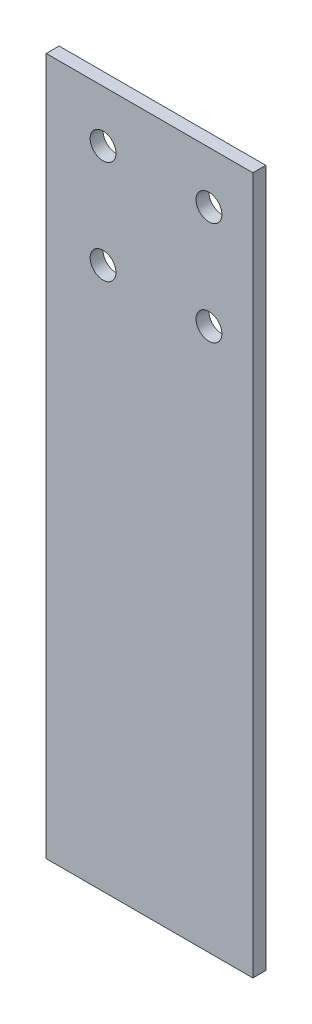
ISO-10303-21;
HEADER;
FILE_DESCRIPTION(('STEP AP214'),'2;1');
FILE_NAME('part.step','',(''),(''),'','','');
FILE_SCHEMA(('AUTOMOTIVE_DESIGN { 1 0 10303 214 1 1 1 1 }'));
ENDSEC;
DATA;
#1=APPLICATION_CONTEXT('core data for automotive mechanical design processes');
#2=APPLICATION_PROTOCOL_DEFINITION('international standard','automotive_design',2000,#1);
#3=PRODUCT_CONTEXT('',#1,'mechanical');
#4=PRODUCT('Part','Part','',(#3));
#5=PRODUCT_RELATED_PRODUCT_CATEGORY('part','',(#4));
#6=PRODUCT_DEFINITION_FORMATION('','',#4);
#7=PRODUCT_DEFINITION_CONTEXT('part definition',#1,'design');
#8=PRODUCT_DEFINITION('design','',#6,#7);
#9=PRODUCT_DEFINITION_SHAPE('','',#8);
#10=(LENGTH_UNIT() NAMED_UNIT(*) SI_UNIT(.MILLI.,.METRE.));
#11=(NAMED_UNIT(*) PLANE_ANGLE_UNIT() SI_UNIT($,.RADIAN.));
#12=(NAMED_UNIT(*) SI_UNIT($,.STERADIAN.) SOLID_ANGLE_UNIT());
#13=UNCERTAINTY_MEASURE_WITH_UNIT(LENGTH_MEASURE(1.E-05),#10,'distance_accuracy_value','');
#14=(GEOMETRIC_REPRESENTATION_CONTEXT(3) GLOBAL_UNCERTAINTY_ASSIGNED_CONTEXT((#13)) GLOBAL_UNIT_ASSIGNED_CONTEXT((#10,
#11,#12)) REPRESENTATION_CONTEXT('',''));
#15=CARTESIAN_POINT('',(0.,0.,0.));
#16=DIRECTION('',(0.,0.,1.));
#17=DIRECTION('',(1.,0.,0.));
#18=AXIS2_PLACEMENT_3D('',#15,#16,#17);
#19=CARTESIAN_POINT('',(-50.8,0.,-3.175));
#20=DIRECTION('',(0.,-1.,0.));
#21=DIRECTION('',(0.,0.,-1.));
#22=AXIS2_PLACEMENT_3D('',#19,#20,#21);
#23=PLANE('',#22);
#24=DIRECTION('',(1.,0.,0.));
#25=VECTOR('',#24,1.);
#26=CARTESIAN_POINT('',(-50.8,0.,0.));
#27=LINE('',#26,#25);
#28=CARTESIAN_POINT('',(-50.8,0.,0.));
#29=VERTEX_POINT('',#28);
#30=CARTESIAN_POINT('',(0.,0.,0.));
#31=VERTEX_POINT('',#30);
#32=EDGE_CURVE('E106',#29,#31,#27,.T.);
#33=ORIENTED_EDGE('',*,*,#32,.F.);
#34=DIRECTION('',(0.,0.,1.));
#35=VECTOR('',#34,1.);
#36=CARTESIAN_POINT('',(-50.8,0.,-3.175));
#37=LINE('',#36,#35);
#38=CARTESIAN_POINT('',(-50.8,0.,-3.175));
#39=VERTEX_POINT('',#38);
#40=EDGE_CURVE('E11',#39,#29,#37,.T.);
#41=ORIENTED_EDGE('',*,*,#40,.F.);
#42=DIRECTION('',(1.,0.,0.));
#43=VECTOR('',#42,1.);
#44=CARTESIAN_POINT('',(-50.8,0.,-3.175));
#45=LINE('',#44,#43);
#46=CARTESIAN_POINT('',(0.,0.,-3.175));
#47=VERTEX_POINT('',#46);
#48=EDGE_CURVE('E99',#39,#47,#45,.T.);
#49=ORIENTED_EDGE('',*,*,#48,.T.);
#50=DIRECTION('',(0.,0.,1.));
#51=VECTOR('',#50,1.);
#52=CARTESIAN_POINT('',(0.,0.,-3.175));
#53=LINE('',#52,#51);
#54=EDGE_CURVE('E44',#47,#31,#53,.T.);
#55=ORIENTED_EDGE('',*,*,#54,.T.);
#56=EDGE_LOOP('',(#33,#41,#49,#55));
#57=FACE_BOUND('',#56,.T.);
#58=ADVANCED_FACE('F41',(#57),#23,.T.);
#59=CARTESIAN_POINT('',(-50.8,171.45,-3.175));
#60=DIRECTION('',(-1.,0.,0.));
#61=DIRECTION('',(0.,-1.,0.));
#62=AXIS2_PLACEMENT_3D('',#59,#60,#61);
#63=PLANE('',#62);
#64=DIRECTION('',(0.,-1.,0.));
#65=VECTOR('',#64,1.);
#66=CARTESIAN_POINT('',(-50.8,171.45,0.));
#67=LINE('',#66,#65);
#68=CARTESIAN_POINT('',(-50.8,171.45,0.));
#69=VERTEX_POINT('',#68);
#70=EDGE_CURVE('E101',#69,#29,#67,.T.);
#71=ORIENTED_EDGE('',*,*,#70,.F.);
#72=DIRECTION('',(0.,0.,1.));
#73=VECTOR('',#72,1.);
#74=CARTESIAN_POINT('',(-50.8,171.45,-3.175));
#75=LINE('',#74,#73);
#76=CARTESIAN_POINT('',(-50.8,171.45,-3.175));
#77=VERTEX_POINT('',#76);
#78=EDGE_CURVE('E50',#77,#69,#75,.T.);
#79=ORIENTED_EDGE('',*,*,#78,.F.);
#80=DIRECTION('',(0.,-1.,0.));
#81=VECTOR('',#80,1.);
#82=CARTESIAN_POINT('',(-50.8,171.45,-3.175));
#83=LINE('',#82,#81);
#84=EDGE_CURVE('E96',#77,#39,#83,.T.);
#85=ORIENTED_EDGE('',*,*,#84,.T.);
#86=ORIENTED_EDGE('',*,*,#40,.T.);
#87=EDGE_LOOP('',(#71,#79,#85,#86));
#88=FACE_BOUND('',#87,.T.);
#89=ADVANCED_FACE('F117',(#88),#63,.T.);
#90=CARTESIAN_POINT('',(0.,171.45,-3.175));
#91=DIRECTION('',(0.,1.,0.));
#92=DIRECTION('',(0.,0.,1.));
#93=AXIS2_PLACEMENT_3D('',#90,#91,#92);
#94=PLANE('',#93);
#95=DIRECTION('',(-1.,0.,0.));
#96=VECTOR('',#95,1.);
#97=CARTESIAN_POINT('',(0.,171.45,0.));
#98=LINE('',#97,#96);
#99=CARTESIAN_POINT('',(0.,171.45,0.));
#100=VERTEX_POINT('',#99);
#101=EDGE_CURVE('E91',#100,#69,#98,.T.);
#102=ORIENTED_EDGE('',*,*,#101,.F.);
#103=DIRECTION('',(0.,0.,1.));
#104=VECTOR('',#103,1.);
#105=CARTESIAN_POINT('',(0.,171.45,-3.175));
#106=LINE('',#105,#104);
#107=CARTESIAN_POINT('',(0.,171.45,-3.175));
#108=VERTEX_POINT('',#107);
#109=EDGE_CURVE('E86',#108,#100,#106,.T.);
#110=ORIENTED_EDGE('',*,*,#109,.F.);
#111=DIRECTION('',(-1.,0.,0.));
#112=VECTOR('',#111,1.);
#113=CARTESIAN_POINT('',(0.,171.45,-3.175));
#114=LINE('',#113,#112);
#115=EDGE_CURVE('E89',#108,#77,#114,.T.);
#116=ORIENTED_EDGE('',*,*,#115,.T.);
#117=ORIENTED_EDGE('',*,*,#78,.T.);
#118=EDGE_LOOP('',(#102,#110,#116,#117));
#119=FACE_BOUND('',#118,.T.);
#120=ADVANCED_FACE('F88',(#119),#94,.T.);
#121=CARTESIAN_POINT('',(0.,0.,-3.175));
#122=DIRECTION('',(1.,0.,0.));
#123=DIRECTION('',(0.,0.,-1.));
#124=AXIS2_PLACEMENT_3D('',#121,#122,#123);
#125=PLANE('',#124);
#126=DIRECTION('',(0.,1.,0.));
#127=VECTOR('',#126,1.);
#128=CARTESIAN_POINT('',(0.,0.,0.));
#129=LINE('',#128,#127);
#130=EDGE_CURVE('E109',#31,#100,#129,.T.);
#131=ORIENTED_EDGE('',*,*,#130,.F.);
#132=ORIENTED_EDGE('',*,*,#54,.F.);
#133=DIRECTION('',(0.,1.,0.));
#134=VECTOR('',#133,1.);
#135=CARTESIAN_POINT('',(0.,0.,-3.175));
#136=LINE('',#135,#134);
#137=EDGE_CURVE('E95',#47,#108,#136,.T.);
#138=ORIENTED_EDGE('',*,*,#137,.T.);
#139=ORIENTED_EDGE('',*,*,#109,.T.);
#140=EDGE_LOOP('',(#131,#132,#138,#139));
#141=FACE_BOUND('',#140,.T.);
#142=ADVANCED_FACE('F98',(#141),#125,.T.);
#143=CARTESIAN_POINT('',(0.,0.,-3.175));
#144=DIRECTION('',(0.,0.,1.));
#145=DIRECTION('',(1.,0.,0.));
#146=AXIS2_PLACEMENT_3D('',#143,#144,#145);
#147=PLANE('',#146);
#148=CARTESIAN_POINT('',(-36.83,158.75,-3.175));
#149=DIRECTION('',(0.,0.,1.));
#150=DIRECTION('',(1.,0.,0.));
#151=AXIS2_PLACEMENT_3D('',#148,#149,#150);
#152=CIRCLE('',#151,3.175);
#153=CARTESIAN_POINT('',(-33.655,158.75,-3.175));
#154=VERTEX_POINT('',#153);
#155=EDGE_CURVE('E168',#154,#154,#152,.T.);
#156=ORIENTED_EDGE('',*,*,#155,.T.);
#157=EDGE_LOOP('',(#156));
#158=FACE_BOUND('',#157,.T.);
#159=CARTESIAN_POINT('',(-10.795,133.35,-3.175));
#160=DIRECTION('',(0.,0.,1.));
#161=DIRECTION('',(1.,0.,0.));
#162=AXIS2_PLACEMENT_3D('',#159,#160,#161);
#163=CIRCLE('',#162,3.175);
#164=CARTESIAN_POINT('',(-7.62000000000002,133.35,-3.175));
#165=VERTEX_POINT('',#164);
#166=EDGE_CURVE('E174',#165,#165,#163,.T.);
#167=ORIENTED_EDGE('',*,*,#166,.T.);
#168=EDGE_LOOP('',(#167));
#169=FACE_BOUND('',#168,.T.);
#170=CARTESIAN_POINT('',(-36.83,133.35,-3.175));
#171=DIRECTION('',(0.,0.,1.));
#172=DIRECTION('',(1.,0.,0.));
#173=AXIS2_PLACEMENT_3D('',#170,#171,#172);
#174=CIRCLE('',#173,3.175);
#175=CARTESIAN_POINT('',(-33.655,133.35,-3.175));
#176=VERTEX_POINT('',#175);
#177=EDGE_CURVE('E159',#176,#176,#174,.T.);
#178=ORIENTED_EDGE('',*,*,#177,.T.);
#179=EDGE_LOOP('',(#178));
#180=FACE_BOUND('',#179,.T.);
#181=CARTESIAN_POINT('',(-10.795,158.75,-3.175));
#182=DIRECTION('',(0.,0.,1.));
#183=DIRECTION('',(1.,0.,0.));
#184=AXIS2_PLACEMENT_3D('',#181,#182,#183);
#185=CIRCLE('',#184,3.175);
#186=CARTESIAN_POINT('',(-7.62000000000002,158.75,-3.175));
#187=VERTEX_POINT('',#186);
#188=EDGE_CURVE('E110',#187,#187,#185,.T.);
#189=ORIENTED_EDGE('',*,*,#188,.T.);
#190=EDGE_LOOP('',(#189));
#191=FACE_BOUND('',#190,.T.);
#192=ORIENTED_EDGE('',*,*,#48,.F.);
#193=ORIENTED_EDGE('',*,*,#84,.F.);
#194=ORIENTED_EDGE('',*,*,#115,.F.);
#195=ORIENTED_EDGE('',*,*,#137,.F.);
#196=EDGE_LOOP('',(#192,#193,#194,#195));
#197=FACE_BOUND('',#196,.T.);
#198=ADVANCED_FACE('F94',(#158,#169,#180,#191,#197),#147,.F.);
#199=CARTESIAN_POINT('',(0.,0.,0.));
#200=DIRECTION('',(0.,0.,1.));
#201=DIRECTION('',(1.,0.,0.));
#202=AXIS2_PLACEMENT_3D('',#199,#200,#201);
#203=PLANE('',#202);
#204=CARTESIAN_POINT('',(-36.83,158.75,0.));
#205=DIRECTION('',(0.,0.,1.));
#206=DIRECTION('',(1.,0.,0.));
#207=AXIS2_PLACEMENT_3D('',#204,#205,#206);
#208=CIRCLE('',#207,3.175);
#209=CARTESIAN_POINT('',(-33.655,158.75,0.));
#210=VERTEX_POINT('',#209);
#211=EDGE_CURVE('E171',#210,#210,#208,.T.);
#212=ORIENTED_EDGE('',*,*,#211,.F.);
#213=EDGE_LOOP('',(#212));
#214=FACE_BOUND('',#213,.T.);
#215=CARTESIAN_POINT('',(-10.795,133.35,0.));
#216=DIRECTION('',(0.,0.,1.));
#217=DIRECTION('',(1.,0.,0.));
#218=AXIS2_PLACEMENT_3D('',#215,#216,#217);
#219=CIRCLE('',#218,3.175);
#220=CARTESIAN_POINT('',(-7.62000000000002,133.35,0.));
#221=VERTEX_POINT('',#220);
#222=EDGE_CURVE('E165',#221,#221,#219,.T.);
#223=ORIENTED_EDGE('',*,*,#222,.F.);
#224=EDGE_LOOP('',(#223));
#225=FACE_BOUND('',#224,.T.);
#226=CARTESIAN_POINT('',(-36.83,133.35,0.));
#227=DIRECTION('',(0.,0.,1.));
#228=DIRECTION('',(1.,0.,0.));
#229=AXIS2_PLACEMENT_3D('',#226,#227,#228);
#230=CIRCLE('',#229,3.175);
#231=CARTESIAN_POINT('',(-33.655,133.35,0.));
#232=VERTEX_POINT('',#231);
#233=EDGE_CURVE('E162',#232,#232,#230,.T.);
#234=ORIENTED_EDGE('',*,*,#233,.F.);
#235=EDGE_LOOP('',(#234));
#236=FACE_BOUND('',#235,.T.);
#237=CARTESIAN_POINT('',(-10.795,158.75,0.));
#238=DIRECTION('',(0.,0.,1.));
#239=DIRECTION('',(1.,0.,0.));
#240=AXIS2_PLACEMENT_3D('',#237,#238,#239);
#241=CIRCLE('',#240,3.175);
#242=CARTESIAN_POINT('',(-7.62000000000002,158.75,0.));
#243=VERTEX_POINT('',#242);
#244=EDGE_CURVE('E170',#243,#243,#241,.T.);
#245=ORIENTED_EDGE('',*,*,#244,.F.);
#246=EDGE_LOOP('',(#245));
#247=FACE_BOUND('',#246,.T.);
#248=ORIENTED_EDGE('',*,*,#32,.T.);
#249=ORIENTED_EDGE('',*,*,#130,.T.);
#250=ORIENTED_EDGE('',*,*,#101,.T.);
#251=ORIENTED_EDGE('',*,*,#70,.T.);
#252=EDGE_LOOP('',(#248,#249,#250,#251));
#253=FACE_BOUND('',#252,.T.);
#254=ADVANCED_FACE('F116',(#214,#225,#236,#247,#253),#203,.T.);
#255=CARTESIAN_POINT('',(-10.795,158.75,-3.175));
#256=DIRECTION('',(0.,0.,1.));
#257=DIRECTION('',(1.,0.,0.));
#258=AXIS2_PLACEMENT_3D('',#255,#256,#257);
#259=CYLINDRICAL_SURFACE('',#258,3.175);
#260=ORIENTED_EDGE('',*,*,#188,.F.);
#261=EDGE_LOOP('',(#260));
#262=FACE_BOUND('',#261,.T.);
#263=ORIENTED_EDGE('',*,*,#244,.T.);
#264=EDGE_LOOP('',(#263));
#265=FACE_BOUND('',#264,.T.);
#266=ADVANCED_FACE('F135',(#262,#265),#259,.F.);
#267=CARTESIAN_POINT('',(-36.83,133.35,-3.175));
#268=DIRECTION('',(0.,0.,1.));
#269=DIRECTION('',(1.,0.,0.));
#270=AXIS2_PLACEMENT_3D('',#267,#268,#269);
#271=CYLINDRICAL_SURFACE('',#270,3.175);
#272=ORIENTED_EDGE('',*,*,#177,.F.);
#273=EDGE_LOOP('',(#272));
#274=FACE_BOUND('',#273,.T.);
#275=ORIENTED_EDGE('',*,*,#233,.T.);
#276=EDGE_LOOP('',(#275));
#277=FACE_BOUND('',#276,.T.);
#278=ADVANCED_FACE('F142',(#274,#277),#271,.F.);
#279=CARTESIAN_POINT('',(-10.795,133.35,-3.175));
#280=DIRECTION('',(0.,0.,1.));
#281=DIRECTION('',(1.,0.,0.));
#282=AXIS2_PLACEMENT_3D('',#279,#280,#281);
#283=CYLINDRICAL_SURFACE('',#282,3.175);
#284=ORIENTED_EDGE('',*,*,#166,.F.);
#285=EDGE_LOOP('',(#284));
#286=FACE_BOUND('',#285,.T.);
#287=ORIENTED_EDGE('',*,*,#222,.T.);
#288=EDGE_LOOP('',(#287));
#289=FACE_BOUND('',#288,.T.);
#290=ADVANCED_FACE('F144',(#286,#289),#283,.F.);
#291=CARTESIAN_POINT('',(-36.83,158.75,-3.175));
#292=DIRECTION('',(0.,0.,1.));
#293=DIRECTION('',(1.,0.,0.));
#294=AXIS2_PLACEMENT_3D('',#291,#292,#293);
#295=CYLINDRICAL_SURFACE('',#294,3.175);
#296=ORIENTED_EDGE('',*,*,#155,.F.);
#297=EDGE_LOOP('',(#296));
#298=FACE_BOUND('',#297,.T.);
#299=ORIENTED_EDGE('',*,*,#211,.T.);
#300=EDGE_LOOP('',(#299));
#301=FACE_BOUND('',#300,.T.);
#302=ADVANCED_FACE('F147',(#298,#301),#295,.F.);
#303=CLOSED_SHELL('',(#58,#89,#120,#142,#198,#254,#266,#278,#290,#302));
#304=MANIFOLD_SOLID_BREP('B2',#303);
#305=ADVANCED_BREP_SHAPE_REPRESENTATION('',(#18,#304),#14);
#306=SHAPE_DEFINITION_REPRESENTATION(#9,#305);
ENDSEC;
END-ISO-10303-21;
